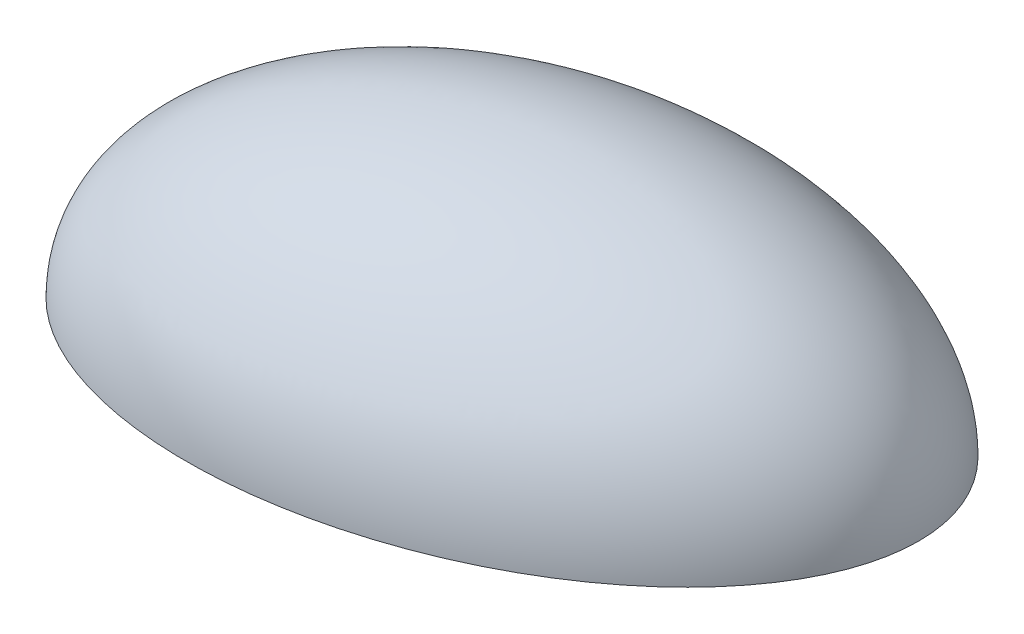
ISO-10303-21;
HEADER;
FILE_DESCRIPTION(('STEP AP214'),'2;1');
FILE_NAME('part.step','',(''),(''),'','','');
FILE_SCHEMA(('AUTOMOTIVE_DESIGN { 1 0 10303 214 1 1 1 1 }'));
ENDSEC;
DATA;
#1=APPLICATION_CONTEXT('core data for automotive mechanical design processes');
#2=APPLICATION_PROTOCOL_DEFINITION('international standard','automotive_design',2000,#1);
#3=PRODUCT_CONTEXT('',#1,'mechanical');
#4=PRODUCT('Part','Part','',(#3));
#5=PRODUCT_RELATED_PRODUCT_CATEGORY('part','',(#4));
#6=PRODUCT_DEFINITION_FORMATION('','',#4);
#7=PRODUCT_DEFINITION_CONTEXT('part definition',#1,'design');
#8=PRODUCT_DEFINITION('design','',#6,#7);
#9=PRODUCT_DEFINITION_SHAPE('','',#8);
#10=(LENGTH_UNIT() NAMED_UNIT(*) SI_UNIT(.MILLI.,.METRE.));
#11=(NAMED_UNIT(*) PLANE_ANGLE_UNIT() SI_UNIT($,.RADIAN.));
#12=(NAMED_UNIT(*) SI_UNIT($,.STERADIAN.) SOLID_ANGLE_UNIT());
#13=UNCERTAINTY_MEASURE_WITH_UNIT(LENGTH_MEASURE(1.E-05),#10,'distance_accuracy_value','');
#14=(GEOMETRIC_REPRESENTATION_CONTEXT(3) GLOBAL_UNCERTAINTY_ASSIGNED_CONTEXT((#13)) GLOBAL_UNIT_ASSIGNED_CONTEXT((#10,
#11,#12)) REPRESENTATION_CONTEXT('',''));
#15=CARTESIAN_POINT('',(0.,0.,0.));
#16=DIRECTION('',(0.,0.,1.));
#17=DIRECTION('',(1.,0.,0.));
#18=AXIS2_PLACEMENT_3D('',#15,#16,#17);
#19=CARTESIAN_POINT('',(0.,0.,0.));
#20=DIRECTION('',(0.,-1.,0.));
#21=DIRECTION('',(0.956943884494194,0.,-0.290272978296572));
#22=AXIS2_PLACEMENT_3D('',#19,#20,#21);
#23=ELLIPSE('',#22,20.,12.5);
#24=TRIMMED_CURVE('',#23,(PARAMETER_VALUE(0.)),(PARAMETER_VALUE(3.14159265358979)),.T.,.PARAMETER.);
#25=CARTESIAN_POINT('',(-19.1388776898839,0.,5.80545956593144));
#26=DIRECTION('',(-0.956943884494194,0.,0.290272978296572));
#27=AXIS1_PLACEMENT('',#25,#26);
#28=SURFACE_OF_REVOLUTION('',#24,#27);
#29=CARTESIAN_POINT('',(0.,0.,0.));
#30=DIRECTION('',(0.,1.,0.));
#31=DIRECTION('',(0.956943884494194,0.,-0.290272978296572));
#32=AXIS2_PLACEMENT_3D('',#29,#30,#31);
#33=ELLIPSE('',#32,20.,12.5);
#34=CARTESIAN_POINT('',(19.1388776898839,0.,-5.80545956593144));
#35=VERTEX_POINT('',#34);
#36=CARTESIAN_POINT('',(-19.1388776898839,0.,5.80545956593144));
#37=VERTEX_POINT('',#36);
#38=EDGE_CURVE('E47',#35,#37,#33,.T.);
#39=ORIENTED_EDGE('',*,*,#38,.T.);
#40=EDGE_CURVE('E41',#35,#37,#23,.T.);
#41=ORIENTED_EDGE('',*,*,#40,.F.);
#42=EDGE_LOOP('',(#39,#41));
#43=FACE_BOUND('',#42,.T.);
#44=ADVANCED_FACE('F32',(#43),#28,.T.);
#45=CARTESIAN_POINT('',(0.,0.,0.));
#46=DIRECTION('',(0.,1.,0.));
#47=DIRECTION('',(0.956943884494194,0.,-0.290272978296572));
#48=AXIS2_PLACEMENT_3D('',#45,#46,#47);
#49=ELLIPSE('',#48,17.,9.5);
#50=TRIMMED_CURVE('',#49,(PARAMETER_VALUE(3.14159265358979)),
(PARAMETER_VALUE(6.28318530717959)),.T.,.PARAMETER.);
#51=CARTESIAN_POINT('',(-19.1388776898839,0.,5.80545956593144));
#52=DIRECTION('',(-0.956943884494194,0.,0.290272978296572));
#53=AXIS1_PLACEMENT('',#51,#52);
#54=SURFACE_OF_REVOLUTION('',#50,#53);
#55=CARTESIAN_POINT('',(0.,0.,0.));
#56=DIRECTION('',(0.,-1.,0.));
#57=DIRECTION('',(0.956943884494194,0.,-0.290272978296572));
#58=AXIS2_PLACEMENT_3D('',#55,#56,#57);
#59=ELLIPSE('',#58,17.,9.5);
#60=CARTESIAN_POINT('',(-16.2680460364013,0.,4.93464063104173));
#61=VERTEX_POINT('',#60);
#62=CARTESIAN_POINT('',(16.2680460364013,0.,-4.93464063104173));
#63=VERTEX_POINT('',#62);
#64=EDGE_CURVE('E54',#61,#63,#59,.T.);
#65=ORIENTED_EDGE('',*,*,#64,.T.);
#66=EDGE_CURVE('E11',#61,#63,#49,.T.);
#67=ORIENTED_EDGE('',*,*,#66,.F.);
#68=EDGE_LOOP('',(#65,#67));
#69=FACE_BOUND('',#68,.T.);
#70=ADVANCED_FACE('F34',(#69),#54,.T.);
#71=CARTESIAN_POINT('',(0.,0.,0.));
#72=DIRECTION('',(0.,-1.,0.));
#73=DIRECTION('',(-0.555549902829641,0.,-0.831483196141676));
#74=AXIS2_PLACEMENT_3D('',#71,#72,#73);
#75=PLANE('',#74);
#76=ORIENTED_EDGE('',*,*,#64,.F.);
#77=ORIENTED_EDGE('',*,*,#66,.T.);
#78=EDGE_LOOP('',(#76,#77));
#79=FACE_BOUND('',#78,.T.);
#80=ORIENTED_EDGE('',*,*,#40,.T.);
#81=ORIENTED_EDGE('',*,*,#38,.F.);
#82=EDGE_LOOP('',(#80,#81));
#83=FACE_BOUND('',#82,.T.);
#84=ADVANCED_FACE('F60',(#79,#83),#75,.T.);
#85=CLOSED_SHELL('',(#44,#70,#84));
#86=MANIFOLD_SOLID_BREP('B2',#85);
#87=ADVANCED_BREP_SHAPE_REPRESENTATION('',(#18,#86),#14);
#88=SHAPE_DEFINITION_REPRESENTATION(#9,#87);
ENDSEC;
END-ISO-10303-21;
